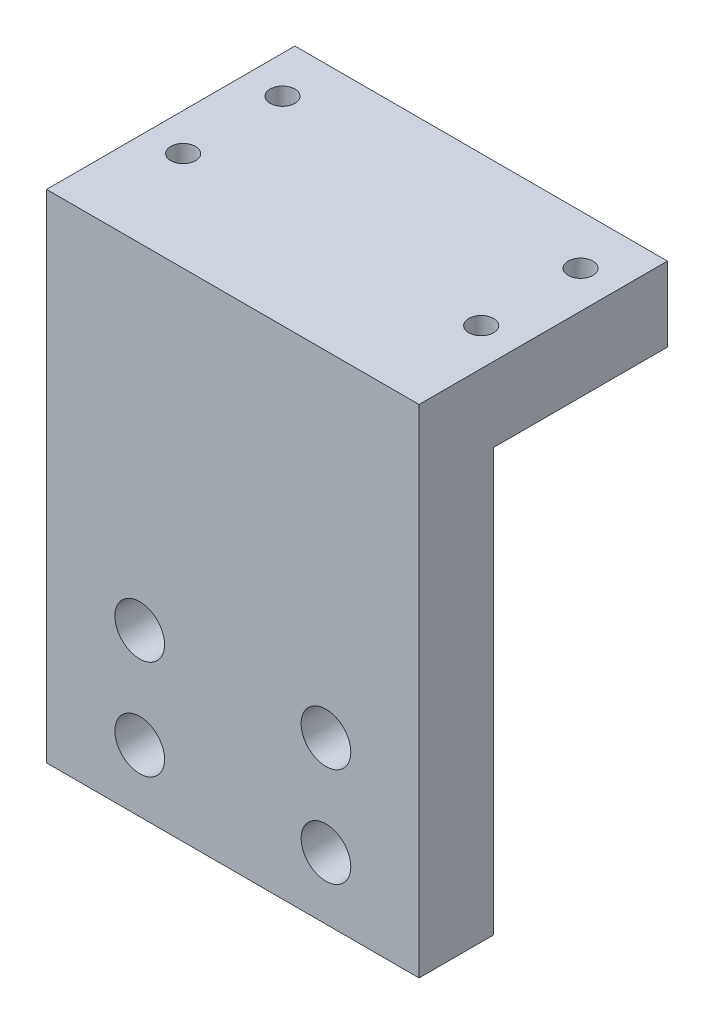
ISO-10303-21;
HEADER;
FILE_DESCRIPTION(('STEP AP214'),'2;1');
FILE_NAME('part.step','',(''),(''),'','','');
FILE_SCHEMA(('AUTOMOTIVE_DESIGN { 1 0 10303 214 1 1 1 1 }'));
ENDSEC;
DATA;
#1=APPLICATION_CONTEXT('core data for automotive mechanical design processes');
#2=APPLICATION_PROTOCOL_DEFINITION('international standard','automotive_design',2000,#1);
#3=PRODUCT_CONTEXT('',#1,'mechanical');
#4=PRODUCT('Part','Part','',(#3));
#5=PRODUCT_RELATED_PRODUCT_CATEGORY('part','',(#4));
#6=PRODUCT_DEFINITION_FORMATION('','',#4);
#7=PRODUCT_DEFINITION_CONTEXT('part definition',#1,'design');
#8=PRODUCT_DEFINITION('design','',#6,#7);
#9=PRODUCT_DEFINITION_SHAPE('','',#8);
#10=(LENGTH_UNIT() NAMED_UNIT(*) SI_UNIT(.MILLI.,.METRE.));
#11=(NAMED_UNIT(*) PLANE_ANGLE_UNIT() SI_UNIT($,.RADIAN.));
#12=(NAMED_UNIT(*) SI_UNIT($,.STERADIAN.) SOLID_ANGLE_UNIT());
#13=UNCERTAINTY_MEASURE_WITH_UNIT(LENGTH_MEASURE(1.E-05),#10,'distance_accuracy_value','');
#14=(GEOMETRIC_REPRESENTATION_CONTEXT(3) GLOBAL_UNCERTAINTY_ASSIGNED_CONTEXT((#13)) GLOBAL_UNIT_ASSIGNED_CONTEXT((#10,
#11,#12)) REPRESENTATION_CONTEXT('',''));
#15=CARTESIAN_POINT('',(0.,0.,0.));
#16=DIRECTION('',(0.,0.,1.));
#17=DIRECTION('',(1.,0.,0.));
#18=AXIS2_PLACEMENT_3D('',#15,#16,#17);
#19=CARTESIAN_POINT('',(150.,-50.,-7.36210198344472));
#20=DIRECTION('',(0.,1.,0.));
#21=DIRECTION('',(0.,0.,1.));
#22=AXIS2_PLACEMENT_3D('',#19,#20,#21);
#23=PLANE('',#22);
#24=DIRECTION('',(0.,0.,-1.));
#25=VECTOR('',#24,1.);
#26=CARTESIAN_POINT('',(0.,-50.,-7.36210198344472));
#27=LINE('',#26,#25);
#28=CARTESIAN_POINT('',(0.,-50.,-7.36210198344472));
#29=VERTEX_POINT('',#28);
#30=CARTESIAN_POINT('',(0.,-50.,-37.3621019834447));
#31=VERTEX_POINT('',#30);
#32=EDGE_CURVE('E117',#29,#31,#27,.T.);
#33=ORIENTED_EDGE('',*,*,#32,.T.);
#34=DIRECTION('',(-1.,0.,0.));
#35=VECTOR('',#34,1.);
#36=CARTESIAN_POINT('',(150.,-50.,-37.3621019834447));
#37=LINE('',#36,#35);
#38=CARTESIAN_POINT('',(150.,-50.,-37.3621019834447));
#39=VERTEX_POINT('',#38);
#40=EDGE_CURVE('E11',#39,#31,#37,.T.);
#41=ORIENTED_EDGE('',*,*,#40,.F.);
#42=DIRECTION('',(0.,0.,-1.));
#43=VECTOR('',#42,1.);
#44=CARTESIAN_POINT('',(150.,-50.,-7.36210198344472));
#45=LINE('',#44,#43);
#46=CARTESIAN_POINT('',(150.,-50.,-7.36210198344472));
#47=VERTEX_POINT('',#46);
#48=EDGE_CURVE('E128',#47,#39,#45,.T.);
#49=ORIENTED_EDGE('',*,*,#48,.F.);
#50=DIRECTION('',(-1.,0.,0.));
#51=VECTOR('',#50,1.);
#52=CARTESIAN_POINT('',(150.,-50.,-7.36210198344472));
#53=LINE('',#52,#51);
#54=EDGE_CURVE('E113',#47,#29,#53,.T.);
#55=ORIENTED_EDGE('',*,*,#54,.T.);
#56=EDGE_LOOP('',(#33,#41,#49,#55));
#57=FACE_BOUND('',#56,.T.);
#58=ADVANCED_FACE('F33',(#57),#23,.F.);
#59=CARTESIAN_POINT('',(150.,-50.,-37.3621019834447));
#60=DIRECTION('',(0.,0.,1.));
#61=DIRECTION('',(1.,0.,0.));
#62=AXIS2_PLACEMENT_3D('',#59,#60,#61);
#63=PLANE('',#62);
#64=CARTESIAN_POINT('',(37.5,15.,-37.3621019834447));
#65=DIRECTION('',(0.,0.,1.));
#66=DIRECTION('',(1.,0.,0.));
#67=AXIS2_PLACEMENT_3D('',#64,#65,#66);
#68=CIRCLE('',#67,10.);
#69=CARTESIAN_POINT('',(47.5,15.,-37.3621019834447));
#70=VERTEX_POINT('',#69);
#71=EDGE_CURVE('E303',#70,#70,#68,.T.);
#72=ORIENTED_EDGE('',*,*,#71,.T.);
#73=EDGE_LOOP('',(#72));
#74=FACE_BOUND('',#73,.T.);
#75=CARTESIAN_POINT('',(112.5,-25.,-37.3621019834447));
#76=DIRECTION('',(0.,0.,1.));
#77=DIRECTION('',(1.,0.,0.));
#78=AXIS2_PLACEMENT_3D('',#75,#76,#77);
#79=CIRCLE('',#78,10.);
#80=CARTESIAN_POINT('',(122.5,-25.,-37.3621019834447));
#81=VERTEX_POINT('',#80);
#82=EDGE_CURVE('E309',#81,#81,#79,.T.);
#83=ORIENTED_EDGE('',*,*,#82,.T.);
#84=EDGE_LOOP('',(#83));
#85=FACE_BOUND('',#84,.T.);
#86=CARTESIAN_POINT('',(112.5,15.,-37.3621019834447));
#87=DIRECTION('',(0.,0.,1.));
#88=DIRECTION('',(1.,0.,0.));
#89=AXIS2_PLACEMENT_3D('',#86,#87,#88);
#90=CIRCLE('',#89,9.99999999999999);
#91=CARTESIAN_POINT('',(122.5,15.,-37.3621019834447));
#92=VERTEX_POINT('',#91);
#93=EDGE_CURVE('E312',#92,#92,#90,.T.);
#94=ORIENTED_EDGE('',*,*,#93,.T.);
#95=EDGE_LOOP('',(#94));
#96=FACE_BOUND('',#95,.T.);
#97=CARTESIAN_POINT('',(37.5,-25.,-37.3621019834447));
#98=DIRECTION('',(0.,0.,1.));
#99=DIRECTION('',(1.,0.,0.));
#100=AXIS2_PLACEMENT_3D('',#97,#98,#99);
#101=CIRCLE('',#100,10.);
#102=CARTESIAN_POINT('',(47.5,-25.,-37.3621019834447));
#103=VERTEX_POINT('',#102);
#104=EDGE_CURVE('E121',#103,#103,#101,.T.);
#105=ORIENTED_EDGE('',*,*,#104,.T.);
#106=EDGE_LOOP('',(#105));
#107=FACE_BOUND('',#106,.T.);
#108=DIRECTION('',(0.,1.,0.));
#109=VECTOR('',#108,1.);
#110=CARTESIAN_POINT('',(0.,-50.,-37.3621019834447));
#111=LINE('',#110,#109);
#112=CARTESIAN_POINT('',(0.,120.,-37.3621019834447));
#113=VERTEX_POINT('',#112);
#114=EDGE_CURVE('E120',#31,#113,#111,.T.);
#115=ORIENTED_EDGE('',*,*,#114,.T.);
#116=DIRECTION('',(-1.,0.,0.));
#117=VECTOR('',#116,1.);
#118=CARTESIAN_POINT('',(150.,120.,-37.3621019834447));
#119=LINE('',#118,#117);
#120=CARTESIAN_POINT('',(150.,120.,-37.3621019834447));
#121=VERTEX_POINT('',#120);
#122=EDGE_CURVE('E41',#121,#113,#119,.T.);
#123=ORIENTED_EDGE('',*,*,#122,.F.);
#124=DIRECTION('',(0.,1.,0.));
#125=VECTOR('',#124,1.);
#126=CARTESIAN_POINT('',(150.,-50.,-37.3621019834447));
#127=LINE('',#126,#125);
#128=EDGE_CURVE('E86',#39,#121,#127,.T.);
#129=ORIENTED_EDGE('',*,*,#128,.F.);
#130=ORIENTED_EDGE('',*,*,#40,.T.);
#131=EDGE_LOOP('',(#115,#123,#129,#130));
#132=FACE_BOUND('',#131,.T.);
#133=ADVANCED_FACE('F156',(#74,#85,#96,#107,#132),#63,.F.);
#134=CARTESIAN_POINT('',(150.,120.,-37.3621019834447));
#135=DIRECTION('',(0.,1.,0.));
#136=DIRECTION('',(0.,0.,1.));
#137=AXIS2_PLACEMENT_3D('',#134,#135,#136);
#138=PLANE('',#137);
#139=CARTESIAN_POINT('',(15.,120.,-47.3621019834447));
#140=DIRECTION('',(0.,1.,0.));
#141=DIRECTION('',(0.,0.,1.));
#142=AXIS2_PLACEMENT_3D('',#139,#140,#141);
#143=CIRCLE('',#142,5.);
#144=CARTESIAN_POINT('',(15.,120.,-42.3621019834447));
#145=VERTEX_POINT('',#144);
#146=EDGE_CURVE('E330',#145,#145,#143,.T.);
#147=ORIENTED_EDGE('',*,*,#146,.T.);
#148=EDGE_LOOP('',(#147));
#149=FACE_BOUND('',#148,.T.);
#150=CARTESIAN_POINT('',(135.,120.,-47.3621019834447));
#151=DIRECTION('',(0.,1.,0.));
#152=DIRECTION('',(0.,0.,1.));
#153=AXIS2_PLACEMENT_3D('',#150,#151,#152);
#154=CIRCLE('',#153,4.99999999999999);
#155=CARTESIAN_POINT('',(135.,120.,-42.3621019834447));
#156=VERTEX_POINT('',#155);
#157=EDGE_CURVE('E333',#156,#156,#154,.T.);
#158=ORIENTED_EDGE('',*,*,#157,.T.);
#159=EDGE_LOOP('',(#158));
#160=FACE_BOUND('',#159,.T.);
#161=CARTESIAN_POINT('',(135.,120.,-87.3621019834447));
#162=DIRECTION('',(0.,1.,0.));
#163=DIRECTION('',(0.,0.,1.));
#164=AXIS2_PLACEMENT_3D('',#161,#162,#163);
#165=CIRCLE('',#164,4.99999999999999);
#166=CARTESIAN_POINT('',(135.,120.,-82.3621019834447));
#167=VERTEX_POINT('',#166);
#168=EDGE_CURVE('E336',#167,#167,#165,.T.);
#169=ORIENTED_EDGE('',*,*,#168,.T.);
#170=EDGE_LOOP('',(#169));
#171=FACE_BOUND('',#170,.T.);
#172=CARTESIAN_POINT('',(15.,120.,-87.3621019834447));
#173=DIRECTION('',(0.,1.,0.));
#174=DIRECTION('',(0.,0.,1.));
#175=AXIS2_PLACEMENT_3D('',#172,#173,#174);
#176=CIRCLE('',#175,5.);
#177=CARTESIAN_POINT('',(15.,120.,-82.3621019834447));
#178=VERTEX_POINT('',#177);
#179=EDGE_CURVE('E320',#178,#178,#176,.T.);
#180=ORIENTED_EDGE('',*,*,#179,.T.);
#181=EDGE_LOOP('',(#180));
#182=FACE_BOUND('',#181,.T.);
#183=DIRECTION('',(0.,0.,-1.));
#184=VECTOR('',#183,1.);
#185=CARTESIAN_POINT('',(0.,120.,-37.3621019834447));
#186=LINE('',#185,#184);
#187=CARTESIAN_POINT('',(0.,120.,-107.362101983445));
#188=VERTEX_POINT('',#187);
#189=EDGE_CURVE('E123',#113,#188,#186,.T.);
#190=ORIENTED_EDGE('',*,*,#189,.T.);
#191=DIRECTION('',(-1.,0.,0.));
#192=VECTOR('',#191,1.);
#193=CARTESIAN_POINT('',(150.,120.,-107.362101983445));
#194=LINE('',#193,#192);
#195=CARTESIAN_POINT('',(150.,120.,-107.362101983445));
#196=VERTEX_POINT('',#195);
#197=EDGE_CURVE('E108',#196,#188,#194,.T.);
#198=ORIENTED_EDGE('',*,*,#197,.F.);
#199=DIRECTION('',(0.,0.,-1.));
#200=VECTOR('',#199,1.);
#201=CARTESIAN_POINT('',(150.,120.,-37.3621019834447));
#202=LINE('',#201,#200);
#203=EDGE_CURVE('E99',#121,#196,#202,.T.);
#204=ORIENTED_EDGE('',*,*,#203,.F.);
#205=ORIENTED_EDGE('',*,*,#122,.T.);
#206=EDGE_LOOP('',(#190,#198,#204,#205));
#207=FACE_BOUND('',#206,.T.);
#208=ADVANCED_FACE('F134',(#149,#160,#171,#182,#207),#138,.F.);
#209=CARTESIAN_POINT('',(150.,120.,-107.362101983445));
#210=DIRECTION('',(0.,0.,1.));
#211=DIRECTION('',(1.,0.,0.));
#212=AXIS2_PLACEMENT_3D('',#209,#210,#211);
#213=PLANE('',#212);
#214=DIRECTION('',(0.,1.,0.));
#215=VECTOR('',#214,1.);
#216=CARTESIAN_POINT('',(0.,120.,-107.362101983445));
#217=LINE('',#216,#215);
#218=CARTESIAN_POINT('',(0.,150.,-107.362101983445));
#219=VERTEX_POINT('',#218);
#220=EDGE_CURVE('E107',#188,#219,#217,.T.);
#221=ORIENTED_EDGE('',*,*,#220,.T.);
#222=DIRECTION('',(-1.,0.,0.));
#223=VECTOR('',#222,1.);
#224=CARTESIAN_POINT('',(150.,150.,-107.362101983445));
#225=LINE('',#224,#223);
#226=CARTESIAN_POINT('',(150.,150.,-107.362101983445));
#227=VERTEX_POINT('',#226);
#228=EDGE_CURVE('E104',#227,#219,#225,.T.);
#229=ORIENTED_EDGE('',*,*,#228,.F.);
#230=DIRECTION('',(0.,1.,0.));
#231=VECTOR('',#230,1.);
#232=CARTESIAN_POINT('',(150.,120.,-107.362101983445));
#233=LINE('',#232,#231);
#234=EDGE_CURVE('E93',#196,#227,#233,.T.);
#235=ORIENTED_EDGE('',*,*,#234,.F.);
#236=ORIENTED_EDGE('',*,*,#197,.T.);
#237=EDGE_LOOP('',(#221,#229,#235,#236));
#238=FACE_BOUND('',#237,.T.);
#239=ADVANCED_FACE('F105',(#238),#213,.F.);
#240=CARTESIAN_POINT('',(150.,150.,-7.36210198344472));
#241=DIRECTION('',(0.,-1.,0.));
#242=DIRECTION('',(0.,0.,-1.));
#243=AXIS2_PLACEMENT_3D('',#240,#241,#242);
#244=PLANE('',#243);
#245=CARTESIAN_POINT('',(15.,150.,-47.3621019834447));
#246=DIRECTION('',(0.,1.,0.));
#247=DIRECTION('',(0.,0.,-1.));
#248=AXIS2_PLACEMENT_3D('',#245,#246,#247);
#249=CIRCLE('',#248,5.);
#250=CARTESIAN_POINT('',(15.,150.,-52.3621019834447));
#251=VERTEX_POINT('',#250);
#252=EDGE_CURVE('E339',#251,#251,#249,.T.);
#253=ORIENTED_EDGE('',*,*,#252,.F.);
#254=EDGE_LOOP('',(#253));
#255=FACE_BOUND('',#254,.T.);
#256=CARTESIAN_POINT('',(135.,150.,-47.3621019834447));
#257=DIRECTION('',(0.,1.,0.));
#258=DIRECTION('',(0.,0.,1.));
#259=AXIS2_PLACEMENT_3D('',#256,#257,#258);
#260=CIRCLE('',#259,4.99999999999999);
#261=CARTESIAN_POINT('',(135.,150.,-42.3621019834447));
#262=VERTEX_POINT('',#261);
#263=EDGE_CURVE('E343',#262,#262,#260,.T.);
#264=ORIENTED_EDGE('',*,*,#263,.F.);
#265=EDGE_LOOP('',(#264));
#266=FACE_BOUND('',#265,.T.);
#267=CARTESIAN_POINT('',(135.,150.,-87.3621019834447));
#268=DIRECTION('',(0.,1.,0.));
#269=DIRECTION('',(0.,0.,-1.));
#270=AXIS2_PLACEMENT_3D('',#267,#268,#269);
#271=CIRCLE('',#270,4.99999999999999);
#272=CARTESIAN_POINT('',(135.,150.,-92.3621019834447));
#273=VERTEX_POINT('',#272);
#274=EDGE_CURVE('E340',#273,#273,#271,.T.);
#275=ORIENTED_EDGE('',*,*,#274,.F.);
#276=EDGE_LOOP('',(#275));
#277=FACE_BOUND('',#276,.T.);
#278=CARTESIAN_POINT('',(15.,150.,-87.3621019834447));
#279=DIRECTION('',(0.,1.,0.));
#280=DIRECTION('',(0.,0.,1.));
#281=AXIS2_PLACEMENT_3D('',#278,#279,#280);
#282=CIRCLE('',#281,5.);
#283=CARTESIAN_POINT('',(15.,150.,-82.3621019834447));
#284=VERTEX_POINT('',#283);
#285=EDGE_CURVE('E327',#284,#284,#282,.T.);
#286=ORIENTED_EDGE('',*,*,#285,.F.);
#287=EDGE_LOOP('',(#286));
#288=FACE_BOUND('',#287,.T.);
#289=DIRECTION('',(0.,0.,1.));
#290=VECTOR('',#289,1.);
#291=CARTESIAN_POINT('',(0.,150.,-7.36210198344472));
#292=LINE('',#291,#290);
#293=CARTESIAN_POINT('',(0.,150.,-7.36210198344472));
#294=VERTEX_POINT('',#293);
#295=EDGE_CURVE('E72',#219,#294,#292,.T.);
#296=ORIENTED_EDGE('',*,*,#295,.T.);
#297=DIRECTION('',(-1.,0.,0.));
#298=VECTOR('',#297,1.);
#299=CARTESIAN_POINT('',(150.,150.,-7.36210198344472));
#300=LINE('',#299,#298);
#301=CARTESIAN_POINT('',(150.,150.,-7.36210198344472));
#302=VERTEX_POINT('',#301);
#303=EDGE_CURVE('E109',#302,#294,#300,.T.);
#304=ORIENTED_EDGE('',*,*,#303,.F.);
#305=DIRECTION('',(0.,0.,1.));
#306=VECTOR('',#305,1.);
#307=CARTESIAN_POINT('',(150.,150.,-7.36210198344472));
#308=LINE('',#307,#306);
#309=EDGE_CURVE('E97',#227,#302,#308,.T.);
#310=ORIENTED_EDGE('',*,*,#309,.F.);
#311=ORIENTED_EDGE('',*,*,#228,.T.);
#312=EDGE_LOOP('',(#296,#304,#310,#311));
#313=FACE_BOUND('',#312,.T.);
#314=ADVANCED_FACE('F111',(#255,#266,#277,#288,#313),#244,.F.);
#315=CARTESIAN_POINT('',(150.,-50.,-7.36210198344472));
#316=DIRECTION('',(0.,0.,-1.));
#317=DIRECTION('',(-1.,0.,0.));
#318=AXIS2_PLACEMENT_3D('',#315,#316,#317);
#319=PLANE('',#318);
#320=CARTESIAN_POINT('',(37.5,15.,-7.36210198344472));
#321=DIRECTION('',(0.,0.,1.));
#322=DIRECTION('',(1.,0.,0.));
#323=AXIS2_PLACEMENT_3D('',#320,#321,#322);
#324=CIRCLE('',#323,10.);
#325=CARTESIAN_POINT('',(47.5,15.,-7.36210198344472));
#326=VERTEX_POINT('',#325);
#327=EDGE_CURVE('E315',#326,#326,#324,.T.);
#328=ORIENTED_EDGE('',*,*,#327,.F.);
#329=EDGE_LOOP('',(#328));
#330=FACE_BOUND('',#329,.T.);
#331=CARTESIAN_POINT('',(112.5,-25.,-7.36210198344472));
#332=DIRECTION('',(0.,0.,1.));
#333=DIRECTION('',(-1.,0.,0.));
#334=AXIS2_PLACEMENT_3D('',#331,#332,#333);
#335=CIRCLE('',#334,10.);
#336=CARTESIAN_POINT('',(102.5,-25.,-7.36210198344472));
#337=VERTEX_POINT('',#336);
#338=EDGE_CURVE('E319',#337,#337,#335,.T.);
#339=ORIENTED_EDGE('',*,*,#338,.F.);
#340=EDGE_LOOP('',(#339));
#341=FACE_BOUND('',#340,.T.);
#342=CARTESIAN_POINT('',(112.5,15.,-7.36210198344472));
#343=DIRECTION('',(0.,0.,1.));
#344=DIRECTION('',(-1.,0.,0.));
#345=AXIS2_PLACEMENT_3D('',#342,#343,#344);
#346=CIRCLE('',#345,9.99999999999999);
#347=CARTESIAN_POINT('',(102.5,15.,-7.36210198344472));
#348=VERTEX_POINT('',#347);
#349=EDGE_CURVE('E316',#348,#348,#346,.T.);
#350=ORIENTED_EDGE('',*,*,#349,.F.);
#351=EDGE_LOOP('',(#350));
#352=FACE_BOUND('',#351,.T.);
#353=CARTESIAN_POINT('',(37.5,-25.,-7.36210198344472));
#354=DIRECTION('',(0.,0.,1.));
#355=DIRECTION('',(1.,0.,0.));
#356=AXIS2_PLACEMENT_3D('',#353,#354,#355);
#357=CIRCLE('',#356,10.);
#358=CARTESIAN_POINT('',(47.5,-25.,-7.36210198344472));
#359=VERTEX_POINT('',#358);
#360=EDGE_CURVE('E298',#359,#359,#357,.T.);
#361=ORIENTED_EDGE('',*,*,#360,.F.);
#362=EDGE_LOOP('',(#361));
#363=FACE_BOUND('',#362,.T.);
#364=DIRECTION('',(0.,-1.,0.));
#365=VECTOR('',#364,1.);
#366=CARTESIAN_POINT('',(0.,-50.,-7.36210198344472));
#367=LINE('',#366,#365);
#368=EDGE_CURVE('E78',#294,#29,#367,.T.);
#369=ORIENTED_EDGE('',*,*,#368,.T.);
#370=ORIENTED_EDGE('',*,*,#54,.F.);
#371=DIRECTION('',(0.,-1.,0.));
#372=VECTOR('',#371,1.);
#373=CARTESIAN_POINT('',(150.,-50.,-7.36210198344472));
#374=LINE('',#373,#372);
#375=EDGE_CURVE('E49',#302,#47,#374,.T.);
#376=ORIENTED_EDGE('',*,*,#375,.F.);
#377=ORIENTED_EDGE('',*,*,#303,.T.);
#378=EDGE_LOOP('',(#369,#370,#376,#377));
#379=FACE_BOUND('',#378,.T.);
#380=ADVANCED_FACE('F141',(#330,#341,#352,#363,#379),#319,.F.);
#381=CARTESIAN_POINT('',(150.,0.,0.));
#382=DIRECTION('',(1.,0.,0.));
#383=DIRECTION('',(0.,0.,-1.));
#384=AXIS2_PLACEMENT_3D('',#381,#382,#383);
#385=PLANE('',#384);
#386=ORIENTED_EDGE('',*,*,#48,.T.);
#387=ORIENTED_EDGE('',*,*,#128,.T.);
#388=ORIENTED_EDGE('',*,*,#203,.T.);
#389=ORIENTED_EDGE('',*,*,#234,.T.);
#390=ORIENTED_EDGE('',*,*,#309,.T.);
#391=ORIENTED_EDGE('',*,*,#375,.T.);
#392=EDGE_LOOP('',(#386,#387,#388,#389,#390,#391));
#393=FACE_BOUND('',#392,.T.);
#394=ADVANCED_FACE('F95',(#393),#385,.T.);
#395=CARTESIAN_POINT('',(0.,0.,0.));
#396=DIRECTION('',(1.,0.,0.));
#397=DIRECTION('',(0.,0.,-1.));
#398=AXIS2_PLACEMENT_3D('',#395,#396,#397);
#399=PLANE('',#398);
#400=ORIENTED_EDGE('',*,*,#32,.F.);
#401=ORIENTED_EDGE('',*,*,#368,.F.);
#402=ORIENTED_EDGE('',*,*,#295,.F.);
#403=ORIENTED_EDGE('',*,*,#220,.F.);
#404=ORIENTED_EDGE('',*,*,#189,.F.);
#405=ORIENTED_EDGE('',*,*,#114,.F.);
#406=EDGE_LOOP('',(#400,#401,#402,#403,#404,#405));
#407=FACE_BOUND('',#406,.T.);
#408=ADVANCED_FACE('F137',(#407),#399,.F.);
#409=CARTESIAN_POINT('',(37.5,-25.,-157.362101983445));
#410=DIRECTION('',(0.,0.,1.));
#411=DIRECTION('',(1.,0.,0.));
#412=AXIS2_PLACEMENT_3D('',#409,#410,#411);
#413=CYLINDRICAL_SURFACE('',#412,10.);
#414=ORIENTED_EDGE('',*,*,#360,.T.);
#415=EDGE_LOOP('',(#414));
#416=FACE_BOUND('',#415,.T.);
#417=ORIENTED_EDGE('',*,*,#104,.F.);
#418=EDGE_LOOP('',(#417));
#419=FACE_BOUND('',#418,.T.);
#420=ADVANCED_FACE('F242',(#416,#419),#413,.F.);
#421=CARTESIAN_POINT('',(112.5,15.,-157.362101983445));
#422=DIRECTION('',(0.,0.,1.));
#423=DIRECTION('',(1.,0.,0.));
#424=AXIS2_PLACEMENT_3D('',#421,#422,#423);
#425=CYLINDRICAL_SURFACE('',#424,9.99999999999999);
#426=ORIENTED_EDGE('',*,*,#349,.T.);
#427=EDGE_LOOP('',(#426));
#428=FACE_BOUND('',#427,.T.);
#429=ORIENTED_EDGE('',*,*,#93,.F.);
#430=EDGE_LOOP('',(#429));
#431=FACE_BOUND('',#430,.T.);
#432=ADVANCED_FACE('F238',(#428,#431),#425,.F.);
#433=CARTESIAN_POINT('',(112.5,-25.,-157.362101983445));
#434=DIRECTION('',(0.,0.,1.));
#435=DIRECTION('',(1.,0.,0.));
#436=AXIS2_PLACEMENT_3D('',#433,#434,#435);
#437=CYLINDRICAL_SURFACE('',#436,10.);
#438=ORIENTED_EDGE('',*,*,#338,.T.);
#439=EDGE_LOOP('',(#438));
#440=FACE_BOUND('',#439,.T.);
#441=ORIENTED_EDGE('',*,*,#82,.F.);
#442=EDGE_LOOP('',(#441));
#443=FACE_BOUND('',#442,.T.);
#444=ADVANCED_FACE('F234',(#440,#443),#437,.F.);
#445=CARTESIAN_POINT('',(37.5,15.,-157.362101983445));
#446=DIRECTION('',(0.,0.,1.));
#447=DIRECTION('',(1.,0.,0.));
#448=AXIS2_PLACEMENT_3D('',#445,#446,#447);
#449=CYLINDRICAL_SURFACE('',#448,10.);
#450=ORIENTED_EDGE('',*,*,#327,.T.);
#451=EDGE_LOOP('',(#450));
#452=FACE_BOUND('',#451,.T.);
#453=ORIENTED_EDGE('',*,*,#71,.F.);
#454=EDGE_LOOP('',(#453));
#455=FACE_BOUND('',#454,.T.);
#456=ADVANCED_FACE('F194',(#452,#455),#449,.F.);
#457=CARTESIAN_POINT('',(15.,-50.,-87.3621019834447));
#458=DIRECTION('',(0.,1.,0.));
#459=DIRECTION('',(0.,0.,1.));
#460=AXIS2_PLACEMENT_3D('',#457,#458,#459);
#461=CYLINDRICAL_SURFACE('',#460,5.);
#462=ORIENTED_EDGE('',*,*,#285,.T.);
#463=EDGE_LOOP('',(#462));
#464=FACE_BOUND('',#463,.T.);
#465=ORIENTED_EDGE('',*,*,#179,.F.);
#466=EDGE_LOOP('',(#465));
#467=FACE_BOUND('',#466,.T.);
#468=ADVANCED_FACE('F188',(#464,#467),#461,.F.);
#469=CARTESIAN_POINT('',(135.,-50.,-87.3621019834447));
#470=DIRECTION('',(0.,1.,0.));
#471=DIRECTION('',(0.,0.,1.));
#472=AXIS2_PLACEMENT_3D('',#469,#470,#471);
#473=CYLINDRICAL_SURFACE('',#472,4.99999999999999);
#474=ORIENTED_EDGE('',*,*,#274,.T.);
#475=EDGE_LOOP('',(#474));
#476=FACE_BOUND('',#475,.T.);
#477=ORIENTED_EDGE('',*,*,#168,.F.);
#478=EDGE_LOOP('',(#477));
#479=FACE_BOUND('',#478,.T.);
#480=ADVANCED_FACE('F193',(#476,#479),#473,.F.);
#481=CARTESIAN_POINT('',(135.,-50.,-47.3621019834447));
#482=DIRECTION('',(0.,1.,0.));
#483=DIRECTION('',(0.,0.,1.));
#484=AXIS2_PLACEMENT_3D('',#481,#482,#483);
#485=CYLINDRICAL_SURFACE('',#484,4.99999999999999);
#486=ORIENTED_EDGE('',*,*,#263,.T.);
#487=EDGE_LOOP('',(#486));
#488=FACE_BOUND('',#487,.T.);
#489=ORIENTED_EDGE('',*,*,#157,.F.);
#490=EDGE_LOOP('',(#489));
#491=FACE_BOUND('',#490,.T.);
#492=ADVANCED_FACE('F206',(#488,#491),#485,.F.);
#493=CARTESIAN_POINT('',(15.,-50.,-47.3621019834447));
#494=DIRECTION('',(0.,1.,0.));
#495=DIRECTION('',(0.,0.,1.));
#496=AXIS2_PLACEMENT_3D('',#493,#494,#495);
#497=CYLINDRICAL_SURFACE('',#496,5.);
#498=ORIENTED_EDGE('',*,*,#252,.T.);
#499=EDGE_LOOP('',(#498));
#500=FACE_BOUND('',#499,.T.);
#501=ORIENTED_EDGE('',*,*,#146,.F.);
#502=EDGE_LOOP('',(#501));
#503=FACE_BOUND('',#502,.T.);
#504=ADVANCED_FACE('F216',(#500,#503),#497,.F.);
#505=CLOSED_SHELL('',(#58,#133,#208,#239,#314,#380,#394,#408,#420,#432,#444,#456,#468,#480,#492,#504));
#506=MANIFOLD_SOLID_BREP('B2',#505);
#507=ADVANCED_BREP_SHAPE_REPRESENTATION('',(#18,#506),#14);
#508=SHAPE_DEFINITION_REPRESENTATION(#9,#507);
ENDSEC;
END-ISO-10303-21;
